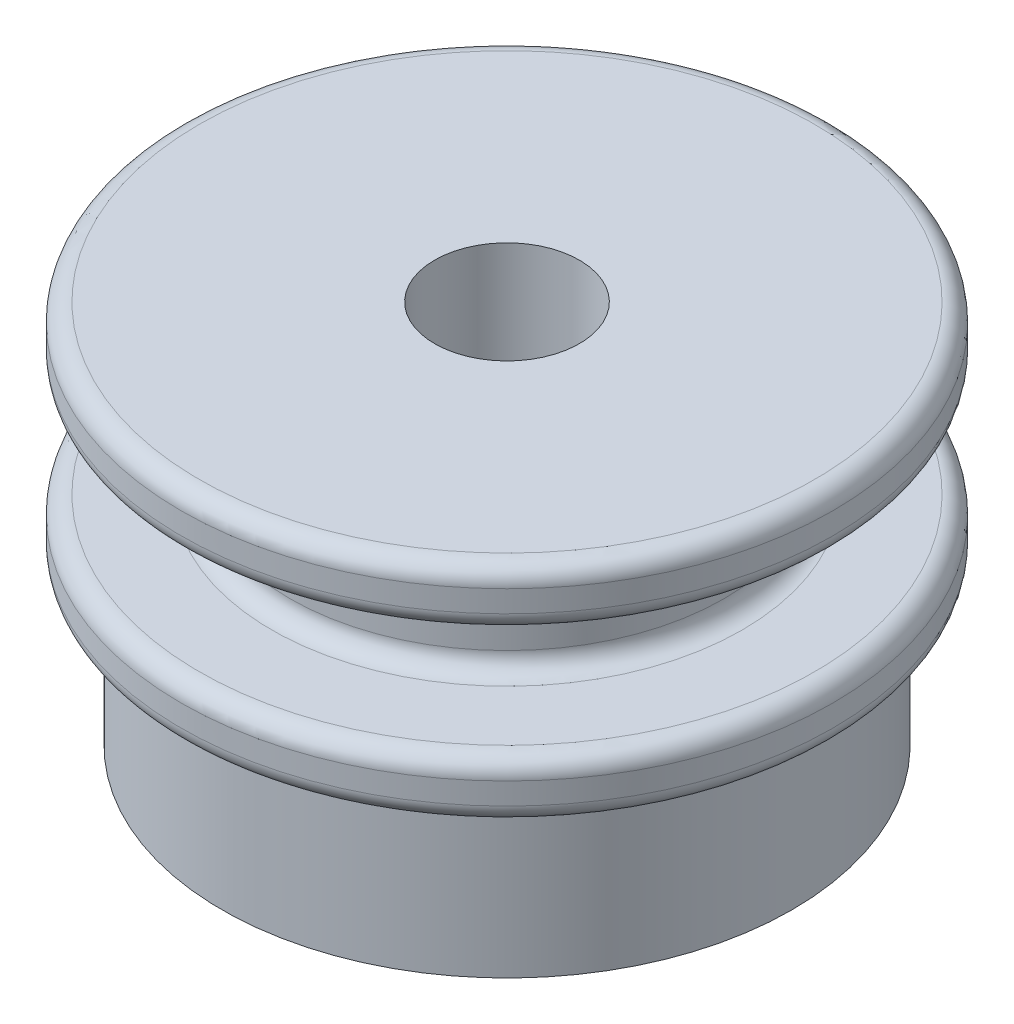
ISO-10303-21;
HEADER;
FILE_DESCRIPTION(('STEP AP214'),'2;1');
FILE_NAME('part.step','',(''),(''),'','','');
FILE_SCHEMA(('AUTOMOTIVE_DESIGN { 1 0 10303 214 1 1 1 1 }'));
ENDSEC;
DATA;
#1=APPLICATION_CONTEXT('core data for automotive mechanical design processes');
#2=APPLICATION_PROTOCOL_DEFINITION('international standard','automotive_design',2000,#1);
#3=PRODUCT_CONTEXT('',#1,'mechanical');
#4=PRODUCT('Part','Part','',(#3));
#5=PRODUCT_RELATED_PRODUCT_CATEGORY('part','',(#4));
#6=PRODUCT_DEFINITION_FORMATION('','',#4);
#7=PRODUCT_DEFINITION_CONTEXT('part definition',#1,'design');
#8=PRODUCT_DEFINITION('design','',#6,#7);
#9=PRODUCT_DEFINITION_SHAPE('','',#8);
#10=(LENGTH_UNIT() NAMED_UNIT(*) SI_UNIT(.MILLI.,.METRE.));
#11=(NAMED_UNIT(*) PLANE_ANGLE_UNIT() SI_UNIT($,.RADIAN.));
#12=(NAMED_UNIT(*) SI_UNIT($,.STERADIAN.) SOLID_ANGLE_UNIT());
#13=UNCERTAINTY_MEASURE_WITH_UNIT(LENGTH_MEASURE(1.E-05),#10,'distance_accuracy_value','');
#14=(GEOMETRIC_REPRESENTATION_CONTEXT(3) GLOBAL_UNCERTAINTY_ASSIGNED_CONTEXT((#13)) GLOBAL_UNIT_ASSIGNED_CONTEXT((#10,
#11,#12)) REPRESENTATION_CONTEXT('',''));
#15=CARTESIAN_POINT('',(0.,0.,0.));
#16=DIRECTION('',(0.,0.,1.));
#17=DIRECTION('',(1.,0.,0.));
#18=AXIS2_PLACEMENT_3D('',#15,#16,#17);
#19=CARTESIAN_POINT('',(0.,-4.92125,0.));
#20=DIRECTION('',(0.,-1.,0.));
#21=DIRECTION('',(1.,0.,0.));
#22=AXIS2_PLACEMENT_3D('',#19,#20,#21);
#23=CYLINDRICAL_SURFACE('',#22,14.2875);
#24=CARTESIAN_POINT('',(0.,4.1275,0.));
#25=DIRECTION('',(0.,1.,0.));
#26=DIRECTION('',(-1.,0.,0.));
#27=AXIS2_PLACEMENT_3D('',#24,#25,#26);
#28=CIRCLE('',#27,14.2875);
#29=CARTESIAN_POINT('',(-14.2875,4.1275,0.));
#30=VERTEX_POINT('',#29);
#31=EDGE_CURVE('E69',#30,#30,#28,.F.);
#32=ORIENTED_EDGE('',*,*,#31,.T.);
#33=EDGE_LOOP('',(#32));
#34=FACE_BOUND('',#33,.T.);
#35=CARTESIAN_POINT('',(0.,3.17499999999999,0.));
#36=DIRECTION('',(0.,-1.,0.));
#37=DIRECTION('',(1.,0.,0.));
#38=AXIS2_PLACEMENT_3D('',#35,#36,#37);
#39=CIRCLE('',#38,14.2875);
#40=CARTESIAN_POINT('',(14.2875,3.17499999999999,0.));
#41=VERTEX_POINT('',#40);
#42=EDGE_CURVE('E72',#41,#41,#39,.F.);
#43=ORIENTED_EDGE('',*,*,#42,.T.);
#44=EDGE_LOOP('',(#43));
#45=FACE_BOUND('',#44,.T.);
#46=ADVANCED_FACE('F31',(#34,#45),#23,.T.);
#47=CARTESIAN_POINT('',(14.2875,2.38125,0.));
#48=DIRECTION('',(0.,-1.,0.));
#49=DIRECTION('',(1.,0.,0.));
#50=AXIS2_PLACEMENT_3D('',#47,#48,#49);
#51=PLANE('',#50);
#52=CARTESIAN_POINT('',(0.,2.38124999999999,0.));
#53=DIRECTION('',(0.,-1.,0.));
#54=DIRECTION('',(1.,0.,0.));
#55=AXIS2_PLACEMENT_3D('',#52,#53,#54);
#56=CIRCLE('',#55,13.49375);
#57=CARTESIAN_POINT('',(13.49375,2.38125,0.));
#58=VERTEX_POINT('',#57);
#59=EDGE_CURVE('E60',#58,#58,#56,.T.);
#60=ORIENTED_EDGE('',*,*,#59,.T.);
#61=EDGE_LOOP('',(#60));
#62=FACE_BOUND('',#61,.T.);
#63=CARTESIAN_POINT('',(0.,2.38124999999999,0.));
#64=DIRECTION('',(0.,-1.,0.));
#65=DIRECTION('',(1.,0.,0.));
#66=AXIS2_PLACEMENT_3D('',#63,#64,#65);
#67=CIRCLE('',#66,10.31875);
#68=CARTESIAN_POINT('',(10.31875,2.38124999999999,0.));
#69=VERTEX_POINT('',#68);
#70=EDGE_CURVE('E63',#69,#69,#67,.F.);
#71=ORIENTED_EDGE('',*,*,#70,.T.);
#72=EDGE_LOOP('',(#71));
#73=FACE_BOUND('',#72,.T.);
#74=ADVANCED_FACE('F148',(#62,#73),#51,.T.);
#75=CARTESIAN_POINT('',(0.,-4.92125,0.));
#76=DIRECTION('',(0.,-1.,0.));
#77=DIRECTION('',(1.,0.,0.));
#78=AXIS2_PLACEMENT_3D('',#75,#76,#77);
#79=CYLINDRICAL_SURFACE('',#78,9.525);
#80=CARTESIAN_POINT('',(0.,-1.58750000000002,0.));
#81=DIRECTION('',(0.,1.,0.));
#82=DIRECTION('',(-1.,0.,0.));
#83=AXIS2_PLACEMENT_3D('',#80,#81,#82);
#84=CIRCLE('',#83,9.525);
#85=CARTESIAN_POINT('',(-9.525,-1.58750000000003,0.));
#86=VERTEX_POINT('',#85);
#87=EDGE_CURVE('E10',#86,#86,#84,.T.);
#88=ORIENTED_EDGE('',*,*,#87,.T.);
#89=EDGE_LOOP('',(#88));
#90=FACE_BOUND('',#89,.T.);
#91=CARTESIAN_POINT('',(0.,1.58749999999999,0.));
#92=DIRECTION('',(0.,-1.,0.));
#93=DIRECTION('',(1.,0.,0.));
#94=AXIS2_PLACEMENT_3D('',#91,#92,#93);
#95=CIRCLE('',#94,9.525);
#96=CARTESIAN_POINT('',(9.525,1.5875,0.));
#97=VERTEX_POINT('',#96);
#98=EDGE_CURVE('E39',#97,#97,#95,.T.);
#99=ORIENTED_EDGE('',*,*,#98,.T.);
#100=EDGE_LOOP('',(#99));
#101=FACE_BOUND('',#100,.T.);
#102=ADVANCED_FACE('F154',(#90,#101),#79,.T.);
#103=CARTESIAN_POINT('',(9.525,-2.38125000000002,0.));
#104=DIRECTION('',(0.,1.,0.));
#105=DIRECTION('',(-1.,0.,0.));
#106=AXIS2_PLACEMENT_3D('',#103,#104,#105);
#107=PLANE('',#106);
#108=CARTESIAN_POINT('',(0.,-2.38125000000002,0.));
#109=DIRECTION('',(0.,1.,0.));
#110=DIRECTION('',(-1.,0.,0.));
#111=AXIS2_PLACEMENT_3D('',#108,#109,#110);
#112=CIRCLE('',#111,13.49375);
#113=CARTESIAN_POINT('',(-13.49375,-2.38125000000003,0.));
#114=VERTEX_POINT('',#113);
#115=EDGE_CURVE('E43',#114,#114,#112,.T.);
#116=ORIENTED_EDGE('',*,*,#115,.T.);
#117=EDGE_LOOP('',(#116));
#118=FACE_BOUND('',#117,.T.);
#119=CARTESIAN_POINT('',(0.,-2.38125000000002,0.));
#120=DIRECTION('',(0.,1.,0.));
#121=DIRECTION('',(-1.,0.,0.));
#122=AXIS2_PLACEMENT_3D('',#119,#120,#121);
#123=CIRCLE('',#122,10.31875);
#124=CARTESIAN_POINT('',(-10.31875,-2.38125000000003,0.));
#125=VERTEX_POINT('',#124);
#126=EDGE_CURVE('E48',#125,#125,#123,.F.);
#127=ORIENTED_EDGE('',*,*,#126,.T.);
#128=EDGE_LOOP('',(#127));
#129=FACE_BOUND('',#128,.T.);
#130=ADVANCED_FACE('F180',(#118,#129),#107,.T.);
#131=CARTESIAN_POINT('',(0.,-4.92125,0.));
#132=DIRECTION('',(0.,-1.,0.));
#133=DIRECTION('',(1.,0.,0.));
#134=AXIS2_PLACEMENT_3D('',#131,#132,#133);
#135=CYLINDRICAL_SURFACE('',#134,14.2875);
#136=CARTESIAN_POINT('',(0.,-4.1275,0.));
#137=DIRECTION('',(0.,-1.,0.));
#138=DIRECTION('',(1.,0.,0.));
#139=AXIS2_PLACEMENT_3D('',#136,#137,#138);
#140=CIRCLE('',#139,14.2875);
#141=CARTESIAN_POINT('',(14.2875,-4.1275,0.));
#142=VERTEX_POINT('',#141);
#143=EDGE_CURVE('E51',#142,#142,#140,.F.);
#144=ORIENTED_EDGE('',*,*,#143,.T.);
#145=EDGE_LOOP('',(#144));
#146=FACE_BOUND('',#145,.T.);
#147=CARTESIAN_POINT('',(0.,-3.17500000000002,0.));
#148=DIRECTION('',(0.,1.,0.));
#149=DIRECTION('',(-1.,0.,0.));
#150=AXIS2_PLACEMENT_3D('',#147,#148,#149);
#151=CIRCLE('',#150,14.2875);
#152=CARTESIAN_POINT('',(-14.2875,-3.17500000000003,0.));
#153=VERTEX_POINT('',#152);
#154=EDGE_CURVE('E54',#153,#153,#151,.F.);
#155=ORIENTED_EDGE('',*,*,#154,.T.);
#156=EDGE_LOOP('',(#155));
#157=FACE_BOUND('',#156,.T.);
#158=ADVANCED_FACE('F126',(#146,#157),#135,.T.);
#159=CARTESIAN_POINT('',(14.2875,-4.92125,0.));
#160=DIRECTION('',(0.,-1.,0.));
#161=DIRECTION('',(1.,0.,0.));
#162=AXIS2_PLACEMENT_3D('',#159,#160,#161);
#163=PLANE('',#162);
#164=CARTESIAN_POINT('',(0.,-4.92125,0.));
#165=DIRECTION('',(0.,-1.,0.));
#166=DIRECTION('',(1.,0.,0.));
#167=AXIS2_PLACEMENT_3D('',#164,#165,#166);
#168=CIRCLE('',#167,12.5);
#169=CARTESIAN_POINT('',(12.5,-4.92125,0.));
#170=VERTEX_POINT('',#169);
#171=EDGE_CURVE('E82',#170,#170,#168,.T.);
#172=ORIENTED_EDGE('',*,*,#171,.F.);
#173=EDGE_LOOP('',(#172));
#174=FACE_BOUND('',#173,.T.);
#175=CARTESIAN_POINT('',(0.,-4.92125,0.));
#176=DIRECTION('',(0.,-1.,0.));
#177=DIRECTION('',(1.,0.,0.));
#178=AXIS2_PLACEMENT_3D('',#175,#176,#177);
#179=CIRCLE('',#178,13.49375);
#180=CARTESIAN_POINT('',(13.49375,-4.92125,0.));
#181=VERTEX_POINT('',#180);
#182=EDGE_CURVE('E57',#181,#181,#179,.T.);
#183=ORIENTED_EDGE('',*,*,#182,.T.);
#184=EDGE_LOOP('',(#183));
#185=FACE_BOUND('',#184,.T.);
#186=ADVANCED_FACE('F122',(#174,#185),#163,.T.);
#187=CARTESIAN_POINT('',(0.,4.92125,0.));
#188=DIRECTION('',(0.,1.,0.));
#189=DIRECTION('',(-1.,0.,0.));
#190=AXIS2_PLACEMENT_3D('',#187,#188,#189);
#191=PLANE('',#190);
#192=CARTESIAN_POINT('',(0.,4.92125,0.));
#193=DIRECTION('',(0.,1.,0.));
#194=DIRECTION('',(-1.,0.,0.));
#195=AXIS2_PLACEMENT_3D('',#192,#193,#194);
#196=CIRCLE('',#195,3.175);
#197=CARTESIAN_POINT('',(-3.175,4.92125,0.));
#198=VERTEX_POINT('',#197);
#199=EDGE_CURVE('E76',#198,#198,#196,.T.);
#200=ORIENTED_EDGE('',*,*,#199,.F.);
#201=EDGE_LOOP('',(#200));
#202=FACE_BOUND('',#201,.T.);
#203=CARTESIAN_POINT('',(0.,4.92125,0.));
#204=DIRECTION('',(0.,1.,0.));
#205=DIRECTION('',(-1.,0.,0.));
#206=AXIS2_PLACEMENT_3D('',#203,#204,#205);
#207=CIRCLE('',#206,13.49375);
#208=CARTESIAN_POINT('',(-13.49375,4.92125,0.));
#209=VERTEX_POINT('',#208);
#210=EDGE_CURVE('E66',#209,#209,#207,.T.);
#211=ORIENTED_EDGE('',*,*,#210,.T.);
#212=EDGE_LOOP('',(#211));
#213=FACE_BOUND('',#212,.T.);
#214=ADVANCED_FACE('F125',(#202,#213),#191,.T.);
#215=CARTESIAN_POINT('',(0.,4.1275,0.));
#216=DIRECTION('',(0.,1.,0.));
#217=DIRECTION('',(-1.,0.,0.));
#218=AXIS2_PLACEMENT_3D('',#215,#216,#217);
#219=TOROIDAL_SURFACE('',#218,13.49375,0.79375);
#220=ORIENTED_EDGE('',*,*,#210,.F.);
#221=EDGE_LOOP('',(#220));
#222=FACE_BOUND('',#221,.T.);
#223=ORIENTED_EDGE('',*,*,#31,.F.);
#224=EDGE_LOOP('',(#223));
#225=FACE_BOUND('',#224,.T.);
#226=ADVANCED_FACE('F143',(#222,#225),#219,.T.);
#227=CARTESIAN_POINT('',(0.,3.17499999999999,0.));
#228=DIRECTION('',(0.,-1.,0.));
#229=DIRECTION('',(1.,0.,0.));
#230=AXIS2_PLACEMENT_3D('',#227,#228,#229);
#231=TOROIDAL_SURFACE('',#230,13.49375,0.79375);
#232=ORIENTED_EDGE('',*,*,#42,.F.);
#233=EDGE_LOOP('',(#232));
#234=FACE_BOUND('',#233,.T.);
#235=ORIENTED_EDGE('',*,*,#59,.F.);
#236=EDGE_LOOP('',(#235));
#237=FACE_BOUND('',#236,.T.);
#238=ADVANCED_FACE('F133',(#234,#237),#231,.T.);
#239=CARTESIAN_POINT('',(0.,-4.1275,0.));
#240=DIRECTION('',(0.,-1.,0.));
#241=DIRECTION('',(1.,0.,0.));
#242=AXIS2_PLACEMENT_3D('',#239,#240,#241);
#243=TOROIDAL_SURFACE('',#242,13.49375,0.79375);
#244=ORIENTED_EDGE('',*,*,#143,.F.);
#245=EDGE_LOOP('',(#244));
#246=FACE_BOUND('',#245,.T.);
#247=ORIENTED_EDGE('',*,*,#182,.F.);
#248=EDGE_LOOP('',(#247));
#249=FACE_BOUND('',#248,.T.);
#250=ADVANCED_FACE('F130',(#246,#249),#243,.T.);
#251=CARTESIAN_POINT('',(0.,-3.17500000000002,0.));
#252=DIRECTION('',(0.,1.,0.));
#253=DIRECTION('',(-1.,0.,0.));
#254=AXIS2_PLACEMENT_3D('',#251,#252,#253);
#255=TOROIDAL_SURFACE('',#254,13.49375,0.79375);
#256=ORIENTED_EDGE('',*,*,#115,.F.);
#257=EDGE_LOOP('',(#256));
#258=FACE_BOUND('',#257,.T.);
#259=ORIENTED_EDGE('',*,*,#154,.F.);
#260=EDGE_LOOP('',(#259));
#261=FACE_BOUND('',#260,.T.);
#262=ADVANCED_FACE('F132',(#258,#261),#255,.T.);
#263=CARTESIAN_POINT('',(0.,-1.58750000000002,0.));
#264=DIRECTION('',(0.,1.,0.));
#265=DIRECTION('',(-1.,0.,0.));
#266=AXIS2_PLACEMENT_3D('',#263,#264,#265);
#267=TOROIDAL_SURFACE('',#266,10.31875,0.79375);
#268=ORIENTED_EDGE('',*,*,#87,.F.);
#269=EDGE_LOOP('',(#268));
#270=FACE_BOUND('',#269,.T.);
#271=ORIENTED_EDGE('',*,*,#126,.F.);
#272=EDGE_LOOP('',(#271));
#273=FACE_BOUND('',#272,.T.);
#274=ADVANCED_FACE('F140',(#270,#273),#267,.F.);
#275=CARTESIAN_POINT('',(0.,1.58749999999999,0.));
#276=DIRECTION('',(0.,-1.,0.));
#277=DIRECTION('',(1.,0.,0.));
#278=AXIS2_PLACEMENT_3D('',#275,#276,#277);
#279=TOROIDAL_SURFACE('',#278,10.31875,0.79375);
#280=ORIENTED_EDGE('',*,*,#70,.F.);
#281=EDGE_LOOP('',(#280));
#282=FACE_BOUND('',#281,.T.);
#283=ORIENTED_EDGE('',*,*,#98,.F.);
#284=EDGE_LOOP('',(#283));
#285=FACE_BOUND('',#284,.T.);
#286=ADVANCED_FACE('F33',(#282,#285),#279,.F.);
#287=CARTESIAN_POINT('',(0.,-1.42875,0.));
#288=DIRECTION('',(0.,1.,0.));
#289=DIRECTION('',(-1.,0.,0.));
#290=AXIS2_PLACEMENT_3D('',#287,#288,#289);
#291=CYLINDRICAL_SURFACE('',#290,3.175);
#292=CARTESIAN_POINT('',(0.,-1.42875,0.));
#293=DIRECTION('',(0.,1.,0.));
#294=DIRECTION('',(-1.,0.,0.));
#295=AXIS2_PLACEMENT_3D('',#292,#293,#294);
#296=CIRCLE('',#295,3.175);
#297=CARTESIAN_POINT('',(-3.175,-1.42875,0.));
#298=VERTEX_POINT('',#297);
#299=EDGE_CURVE('E75',#298,#298,#296,.T.);
#300=ORIENTED_EDGE('',*,*,#299,.F.);
#301=EDGE_LOOP('',(#300));
#302=FACE_BOUND('',#301,.T.);
#303=ORIENTED_EDGE('',*,*,#199,.T.);
#304=EDGE_LOOP('',(#303));
#305=FACE_BOUND('',#304,.T.);
#306=ADVANCED_FACE('F175',(#302,#305),#291,.F.);
#307=CARTESIAN_POINT('',(0.,-1.42875,0.));
#308=DIRECTION('',(0.,1.,0.));
#309=DIRECTION('',(-1.,0.,0.));
#310=AXIS2_PLACEMENT_3D('',#307,#308,#309);
#311=PLANE('',#310);
#312=CARTESIAN_POINT('',(0.,-1.42875,0.));
#313=DIRECTION('',(0.,1.,0.));
#314=DIRECTION('',(-1.,0.,0.));
#315=AXIS2_PLACEMENT_3D('',#312,#313,#314);
#316=CIRCLE('',#315,2.0955);
#317=CARTESIAN_POINT('',(-2.0955,-1.42875,0.));
#318=VERTEX_POINT('',#317);
#319=EDGE_CURVE('E85',#318,#318,#316,.T.);
#320=ORIENTED_EDGE('',*,*,#319,.F.);
#321=EDGE_LOOP('',(#320));
#322=FACE_BOUND('',#321,.T.);
#323=ORIENTED_EDGE('',*,*,#299,.T.);
#324=EDGE_LOOP('',(#323));
#325=FACE_BOUND('',#324,.T.);
#326=ADVANCED_FACE('F118',(#322,#325),#311,.T.);
#327=CARTESIAN_POINT('',(0.,-11.92125,0.));
#328=DIRECTION('',(0.,1.,0.));
#329=DIRECTION('',(-1.,0.,0.));
#330=AXIS2_PLACEMENT_3D('',#327,#328,#329);
#331=CYLINDRICAL_SURFACE('',#330,12.5);
#332=CARTESIAN_POINT('',(0.,-11.92125,0.));
#333=DIRECTION('',(0.,-1.,0.));
#334=DIRECTION('',(1.,0.,0.));
#335=AXIS2_PLACEMENT_3D('',#332,#333,#334);
#336=CIRCLE('',#335,12.5);
#337=CARTESIAN_POINT('',(12.5,-11.92125,0.));
#338=VERTEX_POINT('',#337);
#339=EDGE_CURVE('E79',#338,#338,#336,.T.);
#340=ORIENTED_EDGE('',*,*,#339,.F.);
#341=EDGE_LOOP('',(#340));
#342=FACE_BOUND('',#341,.T.);
#343=ORIENTED_EDGE('',*,*,#171,.T.);
#344=EDGE_LOOP('',(#343));
#345=FACE_BOUND('',#344,.T.);
#346=ADVANCED_FACE('F111',(#342,#345),#331,.T.);
#347=CARTESIAN_POINT('',(0.,-11.92125,0.));
#348=DIRECTION('',(0.,-1.,0.));
#349=DIRECTION('',(1.,0.,0.));
#350=AXIS2_PLACEMENT_3D('',#347,#348,#349);
#351=PLANE('',#350);
#352=CARTESIAN_POINT('',(-6.35,-11.92125,0.));
#353=DIRECTION('',(0.,-1.,0.));
#354=DIRECTION('',(1.,0.,0.));
#355=AXIS2_PLACEMENT_3D('',#352,#353,#354);
#356=CIRCLE('',#355,1.6256);
#357=CARTESIAN_POINT('',(-4.7244,-11.92125,0.));
#358=VERTEX_POINT('',#357);
#359=EDGE_CURVE('E96',#358,#358,#356,.T.);
#360=ORIENTED_EDGE('',*,*,#359,.F.);
#361=EDGE_LOOP('',(#360));
#362=FACE_BOUND('',#361,.T.);
#363=CARTESIAN_POINT('',(6.35,-11.92125,0.));
#364=DIRECTION('',(0.,-1.,0.));
#365=DIRECTION('',(1.,0.,0.));
#366=AXIS2_PLACEMENT_3D('',#363,#364,#365);
#367=CIRCLE('',#366,1.6256);
#368=CARTESIAN_POINT('',(7.9756,-11.92125,0.));
#369=VERTEX_POINT('',#368);
#370=EDGE_CURVE('E90',#369,#369,#367,.T.);
#371=ORIENTED_EDGE('',*,*,#370,.F.);
#372=EDGE_LOOP('',(#371));
#373=FACE_BOUND('',#372,.T.);
#374=CARTESIAN_POINT('',(0.,-11.92125,0.));
#375=DIRECTION('',(0.,-1.,0.));
#376=DIRECTION('',(1.,0.,0.));
#377=AXIS2_PLACEMENT_3D('',#374,#375,#376);
#378=CIRCLE('',#377,2.0955);
#379=CARTESIAN_POINT('',(-2.0955,-11.92125,0.));
#380=VERTEX_POINT('',#379);
#381=EDGE_CURVE('E35',#380,#380,#378,.T.);
#382=ORIENTED_EDGE('',*,*,#381,.F.);
#383=EDGE_LOOP('',(#382));
#384=FACE_BOUND('',#383,.T.);
#385=ORIENTED_EDGE('',*,*,#339,.T.);
#386=EDGE_LOOP('',(#385));
#387=FACE_BOUND('',#386,.T.);
#388=ADVANCED_FACE('F108',(#362,#373,#384,#387),#351,.T.);
#389=CARTESIAN_POINT('',(0.,-11.921262,0.));
#390=DIRECTION('',(0.,1.,0.));
#391=DIRECTION('',(-1.,0.,0.));
#392=AXIS2_PLACEMENT_3D('',#389,#390,#391);
#393=CYLINDRICAL_SURFACE('',#392,2.0955);
#394=CARTESIAN_POINT('',(-2.0955,-1.42875,0.));
#395=CARTESIAN_POINT('',(-2.0955,-1.538046875,0.));
#396=CARTESIAN_POINT('',(-2.0955,-1.64734375,0.));
#397=CARTESIAN_POINT('',(-2.0955,-1.8659375,0.));
#398=CARTESIAN_POINT('',(-2.0955,-1.975234375,0.));
#399=CARTESIAN_POINT('',(-2.0955,-2.193828125,0.));
#400=CARTESIAN_POINT('',(-2.0955,-2.303125,0.));
#401=CARTESIAN_POINT('',(-2.0955,-2.52171875,0.));
#402=CARTESIAN_POINT('',(-2.0955,-2.631015625,0.));
#403=CARTESIAN_POINT('',(-2.0955,-2.849609375,0.));
#404=CARTESIAN_POINT('',(-2.0955,-2.95890625,0.));
#405=CARTESIAN_POINT('',(-2.0955,-3.1775,0.));
#406=CARTESIAN_POINT('',(-2.0955,-3.286796875,0.));
#407=CARTESIAN_POINT('',(-2.0955,-3.505390625,0.));
#408=CARTESIAN_POINT('',(-2.0955,-3.6146875,0.));
#409=CARTESIAN_POINT('',(-2.0955,-3.83328125,0.));
#410=CARTESIAN_POINT('',(-2.0955,-3.942578125,0.));
#411=CARTESIAN_POINT('',(-2.0955,-4.161171875,0.));
#412=CARTESIAN_POINT('',(-2.0955,-4.27046875,0.));
#413=CARTESIAN_POINT('',(-2.0955,-4.4890625,0.));
#414=CARTESIAN_POINT('',(-2.0955,-4.598359375,0.));
#415=CARTESIAN_POINT('',(-2.0955,-4.816953125,0.));
#416=CARTESIAN_POINT('',(-2.0955,-4.92625,0.));
#417=CARTESIAN_POINT('',(-2.0955,-5.14484375,0.));
#418=CARTESIAN_POINT('',(-2.0955,-5.254140625,0.));
#419=CARTESIAN_POINT('',(-2.0955,-5.472734375,0.));
#420=CARTESIAN_POINT('',(-2.0955,-5.58203125,0.));
#421=CARTESIAN_POINT('',(-2.0955,-5.800625,0.));
#422=CARTESIAN_POINT('',(-2.0955,-5.909921875,0.));
#423=CARTESIAN_POINT('',(-2.0955,-6.128515625,0.));
#424=CARTESIAN_POINT('',(-2.0955,-6.2378125,0.));
#425=CARTESIAN_POINT('',(-2.0955,-6.45640625,0.));
#426=CARTESIAN_POINT('',(-2.0955,-6.565703125,0.));
#427=CARTESIAN_POINT('',(-2.0955,-6.784296875,0.));
#428=CARTESIAN_POINT('',(-2.0955,-6.89359375,0.));
#429=CARTESIAN_POINT('',(-2.0955,-7.1121875,0.));
#430=CARTESIAN_POINT('',(-2.0955,-7.221484375,0.));
#431=CARTESIAN_POINT('',(-2.0955,-7.440078125,0.));
#432=CARTESIAN_POINT('',(-2.0955,-7.549375,0.));
#433=CARTESIAN_POINT('',(-2.0955,-7.76796875,0.));
#434=CARTESIAN_POINT('',(-2.0955,-7.877265625,0.));
#435=CARTESIAN_POINT('',(-2.0955,-8.095859375,0.));
#436=CARTESIAN_POINT('',(-2.0955,-8.20515625,0.));
#437=CARTESIAN_POINT('',(-2.0955,-8.42375,0.));
#438=CARTESIAN_POINT('',(-2.0955,-8.533046875,0.));
#439=CARTESIAN_POINT('',(-2.0955,-8.751640625,0.));
#440=CARTESIAN_POINT('',(-2.0955,-8.8609375,0.));
#441=CARTESIAN_POINT('',(-2.0955,-9.07953125,0.));
#442=CARTESIAN_POINT('',(-2.0955,-9.188828125,0.));
#443=CARTESIAN_POINT('',(-2.0955,-9.407421875,0.));
#444=CARTESIAN_POINT('',(-2.0955,-9.51671875,0.));
#445=CARTESIAN_POINT('',(-2.0955,-9.7353125,0.));
#446=CARTESIAN_POINT('',(-2.0955,-9.844609375,0.));
#447=CARTESIAN_POINT('',(-2.0955,-10.063203125,0.));
#448=CARTESIAN_POINT('',(-2.0955,-10.1725,0.));
#449=CARTESIAN_POINT('',(-2.0955,-10.39109375,0.));
#450=CARTESIAN_POINT('',(-2.0955,-10.500390625,0.));
#451=CARTESIAN_POINT('',(-2.0955,-10.718984375,0.));
#452=CARTESIAN_POINT('',(-2.0955,-10.82828125,0.));
#453=CARTESIAN_POINT('',(-2.0955,-11.046875,0.));
#454=CARTESIAN_POINT('',(-2.0955,-11.156171875,0.));
#455=CARTESIAN_POINT('',(-2.0955,-11.374765625,0.));
#456=CARTESIAN_POINT('',(-2.0955,-11.4840625,0.));
#457=CARTESIAN_POINT('',(-2.0955,-11.70265625,0.));
#458=CARTESIAN_POINT('',(-2.0955,-11.811953125,0.));
#459=CARTESIAN_POINT('',(-2.0955,-11.92125,0.));
#460=B_SPLINE_CURVE_WITH_KNOTS('',3,(#394,#395,#396,#397,#398,#399,#400,#401,#402,#403,#404,
#405,#406,#407,#408,#409,#410,#411,#412,#413,#414,#415,#416,#417,#418,#419,#420,#421,#422,#423,
#424,#425,#426,#427,#428,#429,#430,#431,#432,#433,#434,#435,#436,#437,#438,#439,#440,#441,#442,
#443,#444,#445,#446,#447,#448,#449,#450,#451,#452,#453,#454,#455,#456,#457,#458,#459),
.UNSPECIFIED.,.F.,.F.,(4,2,2,2,2,2,2,2,2,2,2,2,2,2,2,2,2,2,2,2,2,2,2,2,2,2,2,2,2,2,2,2,4),(0.,
0.327890625,0.655781250000001,0.983671875,1.3115625,1.639453125,1.96734375,2.295234375,2.623125,
2.951015625,3.27890625,3.606796875,3.9346875,4.262578125,4.59046875,4.918359375,5.24625,
5.574140625,5.90203125,6.229921875,6.5578125,6.885703125,7.21359375,7.541484375,7.869375,
8.197265625,8.52515625,8.853046875,9.1809375,9.508828125,9.83671875,10.164609375,10.4925),.UNSPECIFIED.);
#461=EDGE_CURVE('BSEAM106',#318,#380,#460,.T.);
#462=ORIENTED_EDGE('',*,*,#319,.T.);
#463=ORIENTED_EDGE('',*,*,#381,.T.);
#464=ORIENTED_EDGE('',*,*,#461,.T.);
#465=ORIENTED_EDGE('',*,*,#461,.F.);
#466=EDGE_LOOP('',(#462,#464,#463,#465));
#467=FACE_BOUND('',#466,.T.);
#468=ADVANCED_FACE('F106',(#467),#393,.F.);
#469=CARTESIAN_POINT('',(6.35,-5.57125,0.));
#470=DIRECTION('',(0.,-1.,0.));
#471=DIRECTION('',(1.,0.,0.));
#472=AXIS2_PLACEMENT_3D('',#469,#470,#471);
#473=CYLINDRICAL_SURFACE('',#472,1.6256);
#474=CARTESIAN_POINT('',(6.35,-5.57125,0.));
#475=DIRECTION('',(0.,-1.,0.));
#476=DIRECTION('',(1.,0.,0.));
#477=AXIS2_PLACEMENT_3D('',#474,#475,#476);
#478=CIRCLE('',#477,1.6256);
#479=CARTESIAN_POINT('',(7.9756,-5.57125,0.));
#480=VERTEX_POINT('',#479);
#481=EDGE_CURVE('E93',#480,#480,#478,.T.);
#482=ORIENTED_EDGE('',*,*,#481,.F.);
#483=EDGE_LOOP('',(#482));
#484=FACE_BOUND('',#483,.T.);
#485=ORIENTED_EDGE('',*,*,#370,.T.);
#486=EDGE_LOOP('',(#485));
#487=FACE_BOUND('',#486,.T.);
#488=ADVANCED_FACE('F283',(#484,#487),#473,.F.);
#489=CARTESIAN_POINT('',(6.35,-5.57125,0.));
#490=DIRECTION('',(0.,-1.,0.));
#491=DIRECTION('',(1.,0.,0.));
#492=AXIS2_PLACEMENT_3D('',#489,#490,#491);
#493=PLANE('',#492);
#494=ORIENTED_EDGE('',*,*,#481,.T.);
#495=EDGE_LOOP('',(#494));
#496=FACE_BOUND('',#495,.T.);
#497=ADVANCED_FACE('F298',(#496),#493,.T.);
#498=CARTESIAN_POINT('',(-6.35,-5.57125,0.));
#499=DIRECTION('',(0.,-1.,0.));
#500=DIRECTION('',(1.,0.,0.));
#501=AXIS2_PLACEMENT_3D('',#498,#499,#500);
#502=CYLINDRICAL_SURFACE('',#501,1.6256);
#503=CARTESIAN_POINT('',(-6.35,-5.57125,0.));
#504=DIRECTION('',(0.,-1.,0.));
#505=DIRECTION('',(1.,0.,0.));
#506=AXIS2_PLACEMENT_3D('',#503,#504,#505);
#507=CIRCLE('',#506,1.6256);
#508=CARTESIAN_POINT('',(-4.7244,-5.57125,0.));
#509=VERTEX_POINT('',#508);
#510=EDGE_CURVE('E99',#509,#509,#507,.T.);
#511=ORIENTED_EDGE('',*,*,#510,.F.);
#512=EDGE_LOOP('',(#511));
#513=FACE_BOUND('',#512,.T.);
#514=ORIENTED_EDGE('',*,*,#359,.T.);
#515=EDGE_LOOP('',(#514));
#516=FACE_BOUND('',#515,.T.);
#517=ADVANCED_FACE('F308',(#513,#516),#502,.F.);
#518=CARTESIAN_POINT('',(-6.35,-5.57125,0.));
#519=DIRECTION('',(0.,-1.,0.));
#520=DIRECTION('',(1.,0.,0.));
#521=AXIS2_PLACEMENT_3D('',#518,#519,#520);
#522=PLANE('',#521);
#523=ORIENTED_EDGE('',*,*,#510,.T.);
#524=EDGE_LOOP('',(#523));
#525=FACE_BOUND('',#524,.T.);
#526=ADVANCED_FACE('F318',(#525),#522,.T.);
#527=CLOSED_SHELL('',(#46,#74,#102,#130,#158,#186,#214,#226,#238,#250,#262,#274,#286,#306,#326,
#346,#388,#468,#488,#497,#517,#526));
#528=MANIFOLD_SOLID_BREP('B2',#527);
#529=ADVANCED_BREP_SHAPE_REPRESENTATION('',(#18,#528),#14);
#530=SHAPE_DEFINITION_REPRESENTATION(#9,#529);
ENDSEC;
END-ISO-10303-21;
